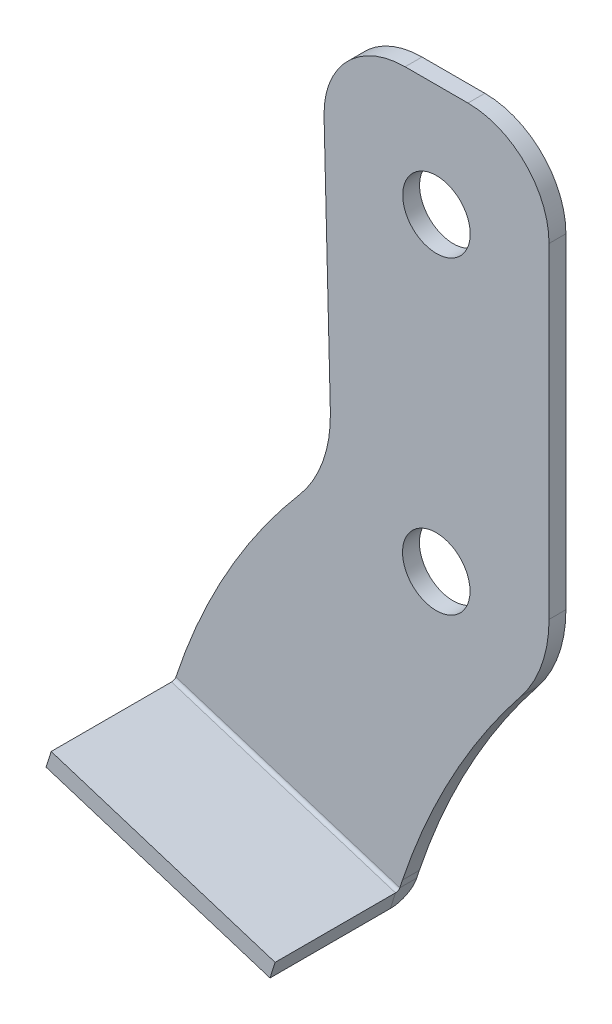
ISO-10303-21;
HEADER;
FILE_DESCRIPTION(('STEP AP214'),'2;1');
FILE_NAME('part.step','',(''),(''),'','','');
FILE_SCHEMA(('AUTOMOTIVE_DESIGN { 1 0 10303 214 1 1 1 1 }'));
ENDSEC;
DATA;
#1=APPLICATION_CONTEXT('core data for automotive mechanical design processes');
#2=APPLICATION_PROTOCOL_DEFINITION('international standard','automotive_design',2000,#1);
#3=PRODUCT_CONTEXT('',#1,'mechanical');
#4=PRODUCT('Part','Part','',(#3));
#5=PRODUCT_RELATED_PRODUCT_CATEGORY('part','',(#4));
#6=PRODUCT_DEFINITION_FORMATION('','',#4);
#7=PRODUCT_DEFINITION_CONTEXT('part definition',#1,'design');
#8=PRODUCT_DEFINITION('design','',#6,#7);
#9=PRODUCT_DEFINITION_SHAPE('','',#8);
#10=(LENGTH_UNIT() NAMED_UNIT(*) SI_UNIT(.MILLI.,.METRE.));
#11=(NAMED_UNIT(*) PLANE_ANGLE_UNIT() SI_UNIT($,.RADIAN.));
#12=(NAMED_UNIT(*) SI_UNIT($,.STERADIAN.) SOLID_ANGLE_UNIT());
#13=UNCERTAINTY_MEASURE_WITH_UNIT(LENGTH_MEASURE(1.E-05),#10,'distance_accuracy_value','');
#14=(GEOMETRIC_REPRESENTATION_CONTEXT(3) GLOBAL_UNCERTAINTY_ASSIGNED_CONTEXT((#13)) GLOBAL_UNIT_ASSIGNED_CONTEXT((#10,
#11,#12)) REPRESENTATION_CONTEXT('',''));
#15=CARTESIAN_POINT('',(0.,0.,0.));
#16=DIRECTION('',(0.,0.,1.));
#17=DIRECTION('',(1.,0.,0.));
#18=AXIS2_PLACEMENT_3D('',#15,#16,#17);
#19=CARTESIAN_POINT('',(6612.86402210719,3373.45886748927,15.));
#20=DIRECTION('',(0.,0.,-1.));
#21=DIRECTION('',(-1.,0.,0.));
#22=AXIS2_PLACEMENT_3D('',#19,#20,#21);
#23=CYLINDRICAL_SURFACE('',#22,634.359253995967);
#24=CARTESIAN_POINT('',(6612.86402210719,3373.45886748927,15.));
#25=DIRECTION('',(0.,0.,-1.));
#26=DIRECTION('',(1.,0.,0.));
#27=AXIS2_PLACEMENT_3D('',#24,#25,#26);
#28=CIRCLE('',#27,634.359253995967);
#29=CARTESIAN_POINT('',(6011.13594484202,3574.29458184577,15.));
#30=VERTEX_POINT('',#29);
#31=CARTESIAN_POINT('',(6116.34409459401,3768.27480525347,15.));
#32=VERTEX_POINT('',#31);
#33=EDGE_CURVE('E146',#30,#32,#28,.T.);
#34=ORIENTED_EDGE('',*,*,#33,.F.);
#35=DIRECTION('',(0.,0.,-1.));
#36=VECTOR('',#35,1.);
#37=CARTESIAN_POINT('',(6011.13594484202,3574.29458184577,15.0000000000001));
#38=LINE('',#37,#36);
#39=CARTESIAN_POINT('',(6011.13594484202,3574.29458184577,0.));
#40=VERTEX_POINT('',#39);
#41=EDGE_CURVE('E159',#30,#40,#38,.T.);
#42=ORIENTED_EDGE('',*,*,#41,.T.);
#43=CARTESIAN_POINT('',(6612.86402210719,3373.45886748927,0.));
#44=DIRECTION('',(0.,0.,-1.));
#45=DIRECTION('',(-1.,0.,0.));
#46=AXIS2_PLACEMENT_3D('',#43,#44,#45);
#47=CIRCLE('',#46,634.359253995967);
#48=CARTESIAN_POINT('',(6116.34409459401,3768.27480525347,0.));
#49=VERTEX_POINT('',#48);
#50=EDGE_CURVE('E161',#40,#49,#47,.T.);
#51=ORIENTED_EDGE('',*,*,#50,.T.);
#52=DIRECTION('',(0.,0.,1.));
#53=VECTOR('',#52,1.);
#54=CARTESIAN_POINT('',(6116.34409459401,3768.27480525347,15.));
#55=LINE('',#54,#53);
#56=EDGE_CURVE('E158',#49,#32,#55,.T.);
#57=ORIENTED_EDGE('',*,*,#56,.T.);
#58=EDGE_LOOP('',(#34,#42,#51,#57));
#59=FACE_BOUND('',#58,.T.);
#60=ADVANCED_FACE('F38',(#59),#23,.F.);
#61=CARTESIAN_POINT('',(6357.69035348699,3450.16649474972,15.));
#62=DIRECTION('',(0.,0.,1.));
#63=DIRECTION('',(1.,0.,0.));
#64=AXIS2_PLACEMENT_3D('',#61,#62,#63);
#65=PLANE('',#64);
#66=DIRECTION('',(-0.300852104091953,-0.953670808750821,0.));
#67=VECTOR('',#66,1.);
#68=CARTESIAN_POINT('',(6011.05306640325,3574.32072729602,15.0000000000026));
#69=LINE('',#68,#67);
#70=CARTESIAN_POINT('',(6011.05306640325,3574.32072729602,15.));
#71=VERTEX_POINT('',#70);
#72=CARTESIAN_POINT('',(6008.79667562256,3567.16819623039,15.));
#73=VERTEX_POINT('',#72);
#74=EDGE_CURVE('E166',#71,#73,#69,.T.);
#75=ORIENTED_EDGE('',*,*,#74,.F.);
#76=DIRECTION('',(-0.953670808750838,0.300852104091899,0.));
#77=VECTOR('',#76,1.);
#78=CARTESIAN_POINT('',(6018.20559746888,3572.06433651533,15.0000000000026));
#79=LINE('',#78,#77);
#80=EDGE_CURVE('E165',#30,#71,#79,.T.);
#81=ORIENTED_EDGE('',*,*,#80,.F.);
#82=ORIENTED_EDGE('',*,*,#33,.T.);
#83=CARTESIAN_POINT('',(6026.0677441371,3840.05952121064,15.));
#84=DIRECTION('',(0.,0.,1.));
#85=DIRECTION('',(1.,0.,0.));
#86=AXIS2_PLACEMENT_3D('',#83,#84,#85);
#87=CIRCLE('',#86,115.338046181084);
#88=CARTESIAN_POINT('',(6141.40579031818,3840.05952121064,15.));
#89=VERTEX_POINT('',#88);
#90=EDGE_CURVE('E128',#32,#89,#87,.T.);
#91=ORIENTED_EDGE('',*,*,#90,.T.);
#92=DIRECTION('',(0.,1.,0.));
#93=VECTOR('',#92,1.);
#94=CARTESIAN_POINT('',(6141.40579031818,4129.48336341519,15.));
#95=LINE('',#94,#93);
#96=CARTESIAN_POINT('',(6141.40579031818,4129.48336341519,15.));
#97=VERTEX_POINT('',#96);
#98=EDGE_CURVE('E143',#89,#97,#95,.T.);
#99=ORIENTED_EDGE('',*,*,#98,.T.);
#100=CARTESIAN_POINT('',(6069.319511455,4129.48336341519,15.));
#101=DIRECTION('',(0.,0.,1.));
#102=DIRECTION('',(1.,0.,0.));
#103=AXIS2_PLACEMENT_3D('',#100,#101,#102);
#104=CIRCLE('',#103,72.0862788631784);
#105=CARTESIAN_POINT('',(6069.319511455,4201.56964227837,15.));
#106=VERTEX_POINT('',#105);
#107=EDGE_CURVE('E151',#97,#106,#104,.T.);
#108=ORIENTED_EDGE('',*,*,#107,.T.);
#109=DIRECTION('',(-1.,0.,0.));
#110=VECTOR('',#109,1.);
#111=CARTESIAN_POINT('',(6013.4696861779,4201.56964227837,15.));
#112=LINE('',#111,#110);
#113=CARTESIAN_POINT('',(6013.4696861779,4201.56964227837,15.));
#114=VERTEX_POINT('',#113);
#115=EDGE_CURVE('E153',#106,#114,#112,.T.);
#116=ORIENTED_EDGE('',*,*,#115,.T.);
#117=CARTESIAN_POINT('',(6013.4696861779,4129.48336341519,15.));
#118=DIRECTION('',(0.,0.,1.));
#119=DIRECTION('',(1.,0.,0.));
#120=AXIS2_PLACEMENT_3D('',#117,#118,#119);
#121=CIRCLE('',#120,72.0862788631777);
#122=CARTESIAN_POINT('',(5941.40579031818,4127.68711347154,15.));
#123=VERTEX_POINT('',#122);
#124=EDGE_CURVE('E182',#114,#123,#121,.T.);
#125=ORIENTED_EDGE('',*,*,#124,.T.);
#126=DIRECTION('',(0.0249180561402385,-0.99968949703305,0.));
#127=VECTOR('',#126,1.);
#128=CARTESIAN_POINT('',(5947.01227174512,3902.76023449351,15.));
#129=LINE('',#128,#127);
#130=CARTESIAN_POINT('',(5947.01227174512,3902.76023449351,15.));
#131=VERTEX_POINT('',#130);
#132=EDGE_CURVE('E178',#123,#131,#129,.T.);
#133=ORIENTED_EDGE('',*,*,#132,.T.);
#134=CARTESIAN_POINT('',(5831.71003836958,3899.88623458366,15.));
#135=DIRECTION('',(0.,0.,-1.));
#136=DIRECTION('',(1.,0.,0.));
#137=AXIS2_PLACEMENT_3D('',#134,#135,#136);
#138=CIRCLE('',#137,115.338046181084);
#139=CARTESIAN_POINT('',(5919.37342422251,3824.93294461137,15.));
#140=VERTEX_POINT('',#139);
#141=EDGE_CURVE('E173',#131,#140,#138,.T.);
#142=ORIENTED_EDGE('',*,*,#141,.T.);
#143=CARTESIAN_POINT('',(6357.69035348699,3450.16649474972,15.));
#144=DIRECTION('',(0.,0.,1.));
#145=DIRECTION('',(1.,0.,0.));
#146=AXIS2_PLACEMENT_3D('',#143,#144,#145);
#147=CIRCLE('',#146,576.690230905426);
#148=CARTESIAN_POINT('',(5809.74425528959,3629.96275692442,15.));
#149=VERTEX_POINT('',#148);
#150=EDGE_CURVE('E171',#140,#149,#147,.T.);
#151=ORIENTED_EDGE('',*,*,#150,.T.);
#152=DIRECTION('',(0.953670808750845,-0.300852104091878,0.));
#153=VECTOR('',#152,1.);
#154=CARTESIAN_POINT('',(6008.79667562256,3567.16819623039,15.0000000000026));
#155=LINE('',#154,#153);
#156=EDGE_CURVE('E269',#73,#149,#155,.F.);
#157=ORIENTED_EDGE('',*,*,#156,.F.);
#158=EDGE_LOOP('',(#75,#81,#82,#91,#99,#108,#116,#125,#133,#142,#151,#157));
#159=FACE_BOUND('',#158,.T.);
#160=CARTESIAN_POINT('',(6041.15278590267,3826.72104320698,15.));
#161=DIRECTION('',(0.,0.,1.));
#162=DIRECTION('',(1.,0.,0.));
#163=AXIS2_PLACEMENT_3D('',#160,#161,#162);
#164=CIRCLE('',#163,29.9999999999998);
#165=CARTESIAN_POINT('',(6071.15278590267,3826.72104320698,15.));
#166=VERTEX_POINT('',#165);
#167=EDGE_CURVE('E320',#166,#166,#164,.T.);
#168=ORIENTED_EDGE('',*,*,#167,.F.);
#169=EDGE_LOOP('',(#168));
#170=FACE_BOUND('',#169,.T.);
#171=CARTESIAN_POINT('',(6041.32431164851,4101.72104320698,15.));
#172=DIRECTION('',(0.,0.,1.));
#173=DIRECTION('',(1.,0.,0.));
#174=AXIS2_PLACEMENT_3D('',#171,#172,#173);
#175=CIRCLE('',#174,30.);
#176=CARTESIAN_POINT('',(6071.32431164851,4101.72104320698,15.));
#177=VERTEX_POINT('',#176);
#178=EDGE_CURVE('E326',#177,#177,#175,.T.);
#179=ORIENTED_EDGE('',*,*,#178,.F.);
#180=EDGE_LOOP('',(#179));
#181=FACE_BOUND('',#180,.T.);
#182=ADVANCED_FACE('F140',(#159,#170,#181),#65,.T.);
#183=CARTESIAN_POINT('',(6357.69035348699,3450.16649474972,0.));
#184=DIRECTION('',(0.,0.,1.));
#185=DIRECTION('',(1.,0.,0.));
#186=AXIS2_PLACEMENT_3D('',#183,#184,#185);
#187=PLANE('',#186);
#188=DIRECTION('',(0.953670808750838,-0.300852104091899,0.));
#189=VECTOR('',#188,1.);
#190=CARTESIAN_POINT('',(6361.93709459733,3463.6282354993,0.));
#191=LINE('',#190,#189);
#192=CARTESIAN_POINT('',(6011.05306640325,3574.32072729602,0.));
#193=VERTEX_POINT('',#192);
#194=EDGE_CURVE('E11',#193,#40,#191,.T.);
#195=ORIENTED_EDGE('',*,*,#194,.F.);
#196=DIRECTION('',(0.300852104091953,0.953670808750821,0.));
#197=VECTOR('',#196,1.);
#198=CARTESIAN_POINT('',(6006.80632529292,3560.85898654647,0.));
#199=LINE('',#198,#197);
#200=CARTESIAN_POINT('',(6008.79667562255,3567.16819623037,2.56045185054177E-12));
#201=VERTEX_POINT('',#200);
#202=EDGE_CURVE('E169',#201,#193,#199,.T.);
#203=ORIENTED_EDGE('',*,*,#202,.F.);
#204=DIRECTION('',(0.953670808750845,-0.300852104091878,0.));
#205=VECTOR('',#204,1.);
#206=CARTESIAN_POINT('',(6008.79667562255,3567.16819623038,2.56045185054177E-12));
#207=LINE('',#206,#205);
#208=CARTESIAN_POINT('',(5809.74425528959,3629.96275692442,0.));
#209=VERTEX_POINT('',#208);
#210=EDGE_CURVE('E239',#201,#209,#207,.F.);
#211=ORIENTED_EDGE('',*,*,#210,.T.);
#212=CARTESIAN_POINT('',(6357.69035348699,3450.16649474972,0.));
#213=DIRECTION('',(0.,0.,1.));
#214=DIRECTION('',(1.,0.,0.));
#215=AXIS2_PLACEMENT_3D('',#212,#213,#214);
#216=CIRCLE('',#215,576.690230905426);
#217=CARTESIAN_POINT('',(5919.37342422251,3824.93294461137,0.));
#218=VERTEX_POINT('',#217);
#219=EDGE_CURVE('E42',#218,#209,#216,.T.);
#220=ORIENTED_EDGE('',*,*,#219,.F.);
#221=CARTESIAN_POINT('',(5831.71003836958,3899.88623458366,0.));
#222=DIRECTION('',(0.,0.,-1.));
#223=DIRECTION('',(-1.,0.,0.));
#224=AXIS2_PLACEMENT_3D('',#221,#222,#223);
#225=CIRCLE('',#224,115.338046181084);
#226=CARTESIAN_POINT('',(5947.01227174512,3902.76023449351,0.));
#227=VERTEX_POINT('',#226);
#228=EDGE_CURVE('E185',#227,#218,#225,.T.);
#229=ORIENTED_EDGE('',*,*,#228,.F.);
#230=DIRECTION('',(0.0249180561402385,-0.99968949703305,0.));
#231=VECTOR('',#230,1.);
#232=CARTESIAN_POINT('',(5947.01227174512,3902.76023449351,0.));
#233=LINE('',#232,#231);
#234=CARTESIAN_POINT('',(5941.40579031818,4127.68711347154,0.));
#235=VERTEX_POINT('',#234);
#236=EDGE_CURVE('E204',#235,#227,#233,.T.);
#237=ORIENTED_EDGE('',*,*,#236,.F.);
#238=CARTESIAN_POINT('',(6013.4696861779,4129.48336341519,0.));
#239=DIRECTION('',(0.,0.,1.));
#240=DIRECTION('',(1.,0.,0.));
#241=AXIS2_PLACEMENT_3D('',#238,#239,#240);
#242=CIRCLE('',#241,72.0862788631777);
#243=CARTESIAN_POINT('',(6013.4696861779,4201.56964227837,0.));
#244=VERTEX_POINT('',#243);
#245=EDGE_CURVE('E200',#244,#235,#242,.T.);
#246=ORIENTED_EDGE('',*,*,#245,.F.);
#247=DIRECTION('',(1.,0.,0.));
#248=VECTOR('',#247,1.);
#249=CARTESIAN_POINT('',(6357.69035348699,4201.56964227837,0.));
#250=LINE('',#249,#248);
#251=CARTESIAN_POINT('',(6069.319511455,4201.56964227837,0.));
#252=VERTEX_POINT('',#251);
#253=EDGE_CURVE('E220',#252,#244,#250,.F.);
#254=ORIENTED_EDGE('',*,*,#253,.F.);
#255=CARTESIAN_POINT('',(6069.319511455,4129.48336341519,0.));
#256=DIRECTION('',(0.,0.,1.));
#257=DIRECTION('',(1.,0.,0.));
#258=AXIS2_PLACEMENT_3D('',#255,#256,#257);
#259=CIRCLE('',#258,72.0862788631784);
#260=CARTESIAN_POINT('',(6141.40579031818,4129.48336341519,0.));
#261=VERTEX_POINT('',#260);
#262=EDGE_CURVE('E216',#261,#252,#259,.T.);
#263=ORIENTED_EDGE('',*,*,#262,.F.);
#264=DIRECTION('',(0.,1.,0.));
#265=VECTOR('',#264,1.);
#266=CARTESIAN_POINT('',(6141.40579031818,3450.16649474972,0.));
#267=LINE('',#266,#265);
#268=CARTESIAN_POINT('',(6141.40579031818,3840.05952121064,0.));
#269=VERTEX_POINT('',#268);
#270=EDGE_CURVE('E135',#269,#261,#267,.T.);
#271=ORIENTED_EDGE('',*,*,#270,.F.);
#272=CARTESIAN_POINT('',(6026.0677441371,3840.05952121064,0.));
#273=DIRECTION('',(0.,0.,1.));
#274=DIRECTION('',(1.,0.,0.));
#275=AXIS2_PLACEMENT_3D('',#272,#273,#274);
#276=CIRCLE('',#275,115.338046181084);
#277=EDGE_CURVE('E130',#49,#269,#276,.T.);
#278=ORIENTED_EDGE('',*,*,#277,.F.);
#279=ORIENTED_EDGE('',*,*,#50,.F.);
#280=EDGE_LOOP('',(#195,#203,#211,#220,#229,#237,#246,#254,#263,#271,#278,#279));
#281=FACE_BOUND('',#280,.T.);
#282=CARTESIAN_POINT('',(6041.15278590267,3826.72104320698,0.));
#283=DIRECTION('',(0.,0.,1.));
#284=DIRECTION('',(1.,0.,0.));
#285=AXIS2_PLACEMENT_3D('',#282,#283,#284);
#286=CIRCLE('',#285,29.9999999999998);
#287=CARTESIAN_POINT('',(6071.15278590267,3826.72104320698,0.));
#288=VERTEX_POINT('',#287);
#289=EDGE_CURVE('E313',#288,#288,#286,.F.);
#290=ORIENTED_EDGE('',*,*,#289,.F.);
#291=EDGE_LOOP('',(#290));
#292=FACE_BOUND('',#291,.T.);
#293=CARTESIAN_POINT('',(6041.32431164851,4101.72104320698,0.));
#294=DIRECTION('',(0.,0.,1.));
#295=DIRECTION('',(1.,0.,0.));
#296=AXIS2_PLACEMENT_3D('',#293,#294,#295);
#297=CIRCLE('',#296,30.);
#298=CARTESIAN_POINT('',(6071.32431164851,4101.72104320698,0.));
#299=VERTEX_POINT('',#298);
#300=EDGE_CURVE('E323',#299,#299,#297,.F.);
#301=ORIENTED_EDGE('',*,*,#300,.F.);
#302=EDGE_LOOP('',(#301));
#303=FACE_BOUND('',#302,.T.);
#304=ADVANCED_FACE('F333',(#281,#292,#303),#187,.F.);
#305=CARTESIAN_POINT('',(6026.0677441371,3840.05952121064,15.));
#306=DIRECTION('',(0.,0.,1.));
#307=DIRECTION('',(1.,0.,0.));
#308=AXIS2_PLACEMENT_3D('',#305,#306,#307);
#309=CYLINDRICAL_SURFACE('',#308,115.338046181084);
#310=ORIENTED_EDGE('',*,*,#56,.F.);
#311=ORIENTED_EDGE('',*,*,#277,.T.);
#312=DIRECTION('',(0.,0.,1.));
#313=VECTOR('',#312,1.);
#314=CARTESIAN_POINT('',(6141.40579031818,3840.05952121064,15.));
#315=LINE('',#314,#313);
#316=EDGE_CURVE('E124',#269,#89,#315,.T.);
#317=ORIENTED_EDGE('',*,*,#316,.T.);
#318=ORIENTED_EDGE('',*,*,#90,.F.);
#319=EDGE_LOOP('',(#310,#311,#317,#318));
#320=FACE_BOUND('',#319,.T.);
#321=ADVANCED_FACE('F127',(#320),#309,.T.);
#322=CARTESIAN_POINT('',(6141.40579031818,4129.48336341519,15.));
#323=DIRECTION('',(1.,0.,0.));
#324=DIRECTION('',(0.,1.,0.));
#325=AXIS2_PLACEMENT_3D('',#322,#323,#324);
#326=PLANE('',#325);
#327=ORIENTED_EDGE('',*,*,#316,.F.);
#328=ORIENTED_EDGE('',*,*,#270,.T.);
#329=DIRECTION('',(0.,0.,1.));
#330=VECTOR('',#329,1.);
#331=CARTESIAN_POINT('',(6141.40579031818,4129.48336341519,15.));
#332=LINE('',#331,#330);
#333=EDGE_CURVE('E150',#261,#97,#332,.T.);
#334=ORIENTED_EDGE('',*,*,#333,.T.);
#335=ORIENTED_EDGE('',*,*,#98,.F.);
#336=EDGE_LOOP('',(#327,#328,#334,#335));
#337=FACE_BOUND('',#336,.T.);
#338=ADVANCED_FACE('F149',(#337),#326,.T.);
#339=CARTESIAN_POINT('',(6069.319511455,4129.48336341519,15.));
#340=DIRECTION('',(0.,0.,1.));
#341=DIRECTION('',(1.,0.,0.));
#342=AXIS2_PLACEMENT_3D('',#339,#340,#341);
#343=CYLINDRICAL_SURFACE('',#342,72.0862788631784);
#344=ORIENTED_EDGE('',*,*,#333,.F.);
#345=ORIENTED_EDGE('',*,*,#262,.T.);
#346=DIRECTION('',(0.,0.,1.));
#347=VECTOR('',#346,1.);
#348=CARTESIAN_POINT('',(6069.319511455,4201.56964227837,15.));
#349=LINE('',#348,#347);
#350=EDGE_CURVE('E219',#252,#106,#349,.T.);
#351=ORIENTED_EDGE('',*,*,#350,.T.);
#352=ORIENTED_EDGE('',*,*,#107,.F.);
#353=EDGE_LOOP('',(#344,#345,#351,#352));
#354=FACE_BOUND('',#353,.T.);
#355=ADVANCED_FACE('F363',(#354),#343,.T.);
#356=CARTESIAN_POINT('',(6013.4696861779,4201.56964227837,15.));
#357=DIRECTION('',(0.,1.,0.));
#358=DIRECTION('',(-1.,0.,0.));
#359=AXIS2_PLACEMENT_3D('',#356,#357,#358);
#360=PLANE('',#359);
#361=ORIENTED_EDGE('',*,*,#350,.F.);
#362=ORIENTED_EDGE('',*,*,#253,.T.);
#363=DIRECTION('',(0.,0.,1.));
#364=VECTOR('',#363,1.);
#365=CARTESIAN_POINT('',(6013.4696861779,4201.56964227837,15.));
#366=LINE('',#365,#364);
#367=EDGE_CURVE('E197',#244,#114,#366,.T.);
#368=ORIENTED_EDGE('',*,*,#367,.T.);
#369=ORIENTED_EDGE('',*,*,#115,.F.);
#370=EDGE_LOOP('',(#361,#362,#368,#369));
#371=FACE_BOUND('',#370,.T.);
#372=ADVANCED_FACE('F360',(#371),#360,.T.);
#373=CARTESIAN_POINT('',(6013.4696861779,4129.48336341519,15.));
#374=DIRECTION('',(0.,0.,1.));
#375=DIRECTION('',(1.,0.,0.));
#376=AXIS2_PLACEMENT_3D('',#373,#374,#375);
#377=CYLINDRICAL_SURFACE('',#376,72.0862788631777);
#378=ORIENTED_EDGE('',*,*,#367,.F.);
#379=ORIENTED_EDGE('',*,*,#245,.T.);
#380=DIRECTION('',(0.,0.,1.));
#381=VECTOR('',#380,1.);
#382=CARTESIAN_POINT('',(5941.40579031818,4127.68711347154,15.));
#383=LINE('',#382,#381);
#384=EDGE_CURVE('E199',#235,#123,#383,.T.);
#385=ORIENTED_EDGE('',*,*,#384,.T.);
#386=ORIENTED_EDGE('',*,*,#124,.F.);
#387=EDGE_LOOP('',(#378,#379,#385,#386));
#388=FACE_BOUND('',#387,.T.);
#389=ADVANCED_FACE('F195',(#388),#377,.T.);
#390=CARTESIAN_POINT('',(5947.01227174512,3902.76023449351,15.));
#391=DIRECTION('',(-0.99968949703305,-0.0249180561402385,0.));
#392=DIRECTION('',(0.0249180561402385,-0.99968949703305,0.));
#393=AXIS2_PLACEMENT_3D('',#390,#391,#392);
#394=PLANE('',#393);
#395=ORIENTED_EDGE('',*,*,#384,.F.);
#396=ORIENTED_EDGE('',*,*,#236,.T.);
#397=DIRECTION('',(0.,0.,1.));
#398=VECTOR('',#397,1.);
#399=CARTESIAN_POINT('',(5947.01227174512,3902.76023449351,15.));
#400=LINE('',#399,#398);
#401=EDGE_CURVE('E206',#227,#131,#400,.T.);
#402=ORIENTED_EDGE('',*,*,#401,.T.);
#403=ORIENTED_EDGE('',*,*,#132,.F.);
#404=EDGE_LOOP('',(#395,#396,#402,#403));
#405=FACE_BOUND('',#404,.T.);
#406=ADVANCED_FACE('F354',(#405),#394,.T.);
#407=CARTESIAN_POINT('',(5831.71003836958,3899.88623458366,15.));
#408=DIRECTION('',(0.,0.,-1.));
#409=DIRECTION('',(-1.,0.,0.));
#410=AXIS2_PLACEMENT_3D('',#407,#408,#409);
#411=CYLINDRICAL_SURFACE('',#410,115.338046181084);
#412=ORIENTED_EDGE('',*,*,#401,.F.);
#413=ORIENTED_EDGE('',*,*,#228,.T.);
#414=DIRECTION('',(0.,0.,1.));
#415=VECTOR('',#414,1.);
#416=CARTESIAN_POINT('',(5919.37342422251,3824.93294461137,15.));
#417=LINE('',#416,#415);
#418=EDGE_CURVE('E212',#218,#140,#417,.T.);
#419=ORIENTED_EDGE('',*,*,#418,.T.);
#420=ORIENTED_EDGE('',*,*,#141,.F.);
#421=EDGE_LOOP('',(#412,#413,#419,#420));
#422=FACE_BOUND('',#421,.T.);
#423=ADVANCED_FACE('F351',(#422),#411,.F.);
#424=CARTESIAN_POINT('',(6357.69035348699,3450.16649474972,15.));
#425=DIRECTION('',(0.,0.,1.));
#426=DIRECTION('',(1.,0.,0.));
#427=AXIS2_PLACEMENT_3D('',#424,#425,#426);
#428=CYLINDRICAL_SURFACE('',#427,576.690230905426);
#429=DIRECTION('',(-3.66571207827473E-13,-1.1619937353898E-12,-1.));
#430=VECTOR('',#429,1.);
#431=CARTESIAN_POINT('',(5809.74425528944,3629.96275692397,15.0000000000026));
#432=LINE('',#431,#430);
#433=EDGE_CURVE('E162',#149,#209,#432,.T.);
#434=ORIENTED_EDGE('',*,*,#433,.F.);
#435=ORIENTED_EDGE('',*,*,#150,.F.);
#436=ORIENTED_EDGE('',*,*,#418,.F.);
#437=ORIENTED_EDGE('',*,*,#219,.T.);
#438=EDGE_LOOP('',(#434,#435,#436,#437));
#439=FACE_BOUND('',#438,.T.);
#440=ADVANCED_FACE('F40',(#439),#428,.T.);
#441=CARTESIAN_POINT('',(6011.05306640325,3574.32072729602,15.0000000000026));
#442=DIRECTION('',(0.953670808750821,-0.300852104091953,0.));
#443=DIRECTION('',(0.300852104091953,0.953670808750821,0.));
#444=AXIS2_PLACEMENT_3D('',#441,#442,#443);
#445=PLANE('',#444);
#446=DIRECTION('',(-3.66571207827473E-13,-1.1619937353898E-12,-1.));
#447=VECTOR('',#446,1.);
#448=CARTESIAN_POINT('',(6008.79667562256,3567.16819623039,15.0000000000026));
#449=LINE('',#448,#447);
#450=EDGE_CURVE('E231',#73,#201,#449,.T.);
#451=ORIENTED_EDGE('',*,*,#450,.T.);
#452=ORIENTED_EDGE('',*,*,#202,.T.);
#453=DIRECTION('',(0.,0.,-1.));
#454=VECTOR('',#453,1.);
#455=CARTESIAN_POINT('',(6011.05306640325,3574.32072729602,15.0000000000026));
#456=LINE('',#455,#454);
#457=EDGE_CURVE('E48',#71,#193,#456,.T.);
#458=ORIENTED_EDGE('',*,*,#457,.F.);
#459=ORIENTED_EDGE('',*,*,#74,.T.);
#460=EDGE_LOOP('',(#451,#452,#458,#459));
#461=FACE_BOUND('',#460,.T.);
#462=ADVANCED_FACE('F343',(#461),#445,.T.);
#463=CARTESIAN_POINT('',(6018.20559746888,3572.06433651533,15.0000000000026));
#464=DIRECTION('',(-0.300852104091899,-0.953670808750838,0.));
#465=DIRECTION('',(0.953670808750838,-0.300852104091899,0.));
#466=AXIS2_PLACEMENT_3D('',#463,#464,#465);
#467=PLANE('',#466);
#468=ORIENTED_EDGE('',*,*,#41,.F.);
#469=ORIENTED_EDGE('',*,*,#80,.T.);
#470=ORIENTED_EDGE('',*,*,#457,.T.);
#471=ORIENTED_EDGE('',*,*,#194,.T.);
#472=EDGE_LOOP('',(#468,#469,#470,#471));
#473=FACE_BOUND('',#472,.T.);
#474=ADVANCED_FACE('F346',(#473),#467,.T.);
#475=CARTESIAN_POINT('',(5809.74425528945,3629.96275692399,-0.149999999997436));
#476=CARTESIAN_POINT('',(5809.02723770046,3627.69725657591,-0.14999999999997));
#477=CARTESIAN_POINT('',(5808.31075985005,3625.43346448646,0.322395918468333));
#478=CARTESIAN_POINT('',(5806.98580093143,3621.24822186658,2.14077705136605));
#479=CARTESIAN_POINT('',(5806.37796876652,3619.32882696504,3.48604681046894));
#480=CARTESIAN_POINT('',(5805.36289659202,3616.12589405103,6.84597703245116));
#481=CARTESIAN_POINT('',(5804.95605430561,3614.84361678094,8.85931550626345));
#482=CARTESIAN_POINT('',(5804.40476041812,3613.11081423344,13.2492758988762));
#483=CARTESIAN_POINT('',(5804.26052444461,3612.66097114459,15.6237422004991));
#484=CARTESIAN_POINT('',(5804.25840901446,3612.66163849396,17.9999999999997));
#485=CARTESIAN_POINT('',(5809.74425528945,3629.96275692399,2.56392129749372E-12));
#486=CARTESIAN_POINT('',(5809.03314598277,3627.71598523459,0.));
#487=CARTESIAN_POINT('',(5808.32257196031,3625.47090768394,0.468491819968615));
#488=CARTESIAN_POINT('',(5807.00852815592,3621.32026487463,2.27184500961924));
#489=CARTESIAN_POINT('',(5806.40570191759,3619.41673825515,3.60599683682872));
#490=CARTESIAN_POINT('',(5805.39898380984,3616.24028688967,6.93815904044744));
#491=CARTESIAN_POINT('',(5804.99548637663,3614.96861246669,8.93485835331914));
#492=CARTESIAN_POINT('',(5804.44871367749,3613.25014162998,13.2885380815301));
#493=CARTESIAN_POINT('',(5804.30565226023,3612.80402176591,15.6433806947316));
#494=CARTESIAN_POINT('',(5804.30353683008,3612.80468911527,17.9999999999997));
#495=CARTESIAN_POINT('',(5809.74425528944,3629.96275692398,15.0000000000026));
#496=CARTESIAN_POINT('',(5809.62397421388,3629.58885110231,15.0000000000021));
#497=CARTESIAN_POINT('',(5809.50378298657,3629.21522743242,15.0780819699968));
#498=CARTESIAN_POINT('',(5809.28125060449,3628.52456567931,15.3786408349383));
#499=CARTESIAN_POINT('',(5809.1790170241,3628.20786726695,15.6009994728063));
#500=CARTESIAN_POINT('',(5809.00770559146,3627.67957075449,16.1563598400757));
#501=CARTESIAN_POINT('',(5808.93869347858,3627.46818104155,16.4891430588875));
#502=CARTESIAN_POINT('',(5808.84403961404,3627.18288128387,17.2147563469221));
#503=CARTESIAN_POINT('',(5808.81843382159,3627.10908389717,17.6072301179842));
#504=CARTESIAN_POINT('',(5808.81631839146,3627.10975124654,17.9999999999998));
#505=CARTESIAN_POINT('',(5809.74425528944,3629.96275692398,15.1515000000026));
#506=CARTESIAN_POINT('',(5809.62994157902,3629.60776704757,15.1515000000022));
#507=CARTESIAN_POINT('',(5809.51571321794,3629.25304506188,15.2256388305121));
#508=CARTESIAN_POINT('',(5809.30420510122,3628.59732911744,15.5110194727741));
#509=CARTESIAN_POINT('',(5809.20702750667,3628.29665766997,15.7221489994297));
#510=CARTESIAN_POINT('',(5809.04415368145,3627.79510752152,16.2494636681519));
#511=CARTESIAN_POINT('',(5808.97851987031,3627.59442668415,16.5654413344138));
#512=CARTESIAN_POINT('',(5808.888432406,3627.32360195438,17.2544111514026));
#513=CARTESIAN_POINT('',(5808.86401291536,3627.2535650247,17.6270649971591));
#514=CARTESIAN_POINT('',(5808.86189748523,3627.25423237406,17.9999999999998));
#515=B_SPLINE_SURFACE_WITH_KNOTS('',1,3,((#475,#476,#477,#478,#479,#480,#481,#482,#483,#484),
(#485,#486,#487,#488,#489,#490,#491,#492,#493,#494),(#495,#496,#497,#498,#499,#500,#501,#502,
#503,#504),(#505,#506,#507,#508,#509,#510,#511,#512,#513,#514)),.UNSPECIFIED.,.F.,.F.,.F.,(2,1,
1,2),(4,2,2,2,4),(-0.01,0.,1.,1.0101),(0.,0.25,0.5,0.75,1.),.UNSPECIFIED.);
#516=DIRECTION('',(-0.300852104091907,-0.953670808750835,0.));
#517=VECTOR('',#516,1.);
#518=CARTESIAN_POINT('',(5808.81631839146,3627.10975124654,17.9999999999998));
#519=LINE('',#518,#517);
#520=CARTESIAN_POINT('',(5808.81631839146,3627.10975124654,17.9999999999998));
#521=VERTEX_POINT('',#520);
#522=CARTESIAN_POINT('',(5804.30353683008,3612.80468911527,17.9999999999997));
#523=VERTEX_POINT('',#522);
#524=EDGE_CURVE('E309',#521,#523,#519,.T.);
#525=CARTESIAN_POINT('',(5809.74425528944,3629.96275692398,15.0000000000026));
#526=CARTESIAN_POINT('',(5809.72922285031,3629.91602707398,14.9999989587362));
#527=CARTESIAN_POINT('',(5809.71419043782,3629.86929730848,15.001204748627));
#528=CARTESIAN_POINT('',(5809.68416117608,3629.77595050932,15.0060225141468));
#529=CARTESIAN_POINT('',(5809.66916432682,3629.72933347565,15.0096344897757));
#530=CARTESIAN_POINT('',(5809.63924170143,3629.63632470297,15.0192571501956));
#531=CARTESIAN_POINT('',(5809.6243159253,3629.58993296397,15.0252678349865));
#532=CARTESIAN_POINT('',(5809.59457076192,3629.49748672794,15.0396731052291));
#533=CARTESIAN_POINT('',(5809.57975137466,3629.45143223091,15.0480676906808));
#534=CARTESIAN_POINT('',(5809.5502540546,3629.35977163319,15.0672206269037));
#535=CARTESIAN_POINT('',(5809.5355761218,3629.3141655325,15.077978977675));
#536=CARTESIAN_POINT('',(5809.5063964338,3629.22351179638,15.1018335031614));
#537=CARTESIAN_POINT('',(5809.49189467861,3629.17846416095,15.1149296778766));
#538=CARTESIAN_POINT('',(5809.46310164501,3629.08903608026,15.1434283077335));
#539=CARTESIAN_POINT('',(5809.44881036661,3629.044655635,15.1588307628753));
#540=CARTESIAN_POINT('',(5809.42047207859,3628.95666905189,15.1919048460298));
#541=CARTESIAN_POINT('',(5809.40642506897,3628.91306291404,15.2095764740425));
#542=CARTESIAN_POINT('',(5809.37860852209,3628.82673019769,15.2471463308926));
#543=CARTESIAN_POINT('',(5809.36483898483,3628.78400361919,15.26704455973));
#544=CARTESIAN_POINT('',(5809.33760991776,3628.69953315455,15.3090196815319));
#545=CARTESIAN_POINT('',(5809.32415038795,3628.6577892684,15.3310965744964));
#546=CARTESIAN_POINT('',(5809.29757312406,3628.57538495406,15.377375839416));
#547=CARTESIAN_POINT('',(5809.28445538997,3628.53472452586,15.401578211371));
#548=CARTESIAN_POINT('',(5809.25859268238,3628.45458528289,15.4520501286294));
#549=CARTESIAN_POINT('',(5809.24584770887,3628.41510646811,15.4783196739327));
#550=CARTESIAN_POINT('',(5809.22076058928,3628.33742576081,15.532862652254));
#551=CARTESIAN_POINT('',(5809.20841844319,3628.29922386829,15.5611360852721));
#552=CARTESIAN_POINT('',(5809.18416607483,3628.22418923815,15.6196187258459));
#553=CARTESIAN_POINT('',(5809.17225585255,3628.18735650053,15.6498279334015));
#554=CARTESIAN_POINT('',(5809.14889538766,3628.11514911439,15.7121093464236));
#555=CARTESIAN_POINT('',(5809.13744514505,3628.07977446588,15.7441815518901));
#556=CARTESIAN_POINT('',(5809.11503158721,3628.01056867953,15.8101116959816));
#557=CARTESIAN_POINT('',(5809.10406827198,3627.97673754168,15.8439696346066));
#558=CARTESIAN_POINT('',(5809.08265434357,3627.91070047976,15.9133896782754));
#559=CARTESIAN_POINT('',(5809.0722037304,3627.87849455568,15.9489517833192));
#560=CARTESIAN_POINT('',(5809.05183974562,3627.81578570911,16.0216944875997));
#561=CARTESIAN_POINT('',(5809.04192637402,3627.78528278662,16.0588750868365));
#562=CARTESIAN_POINT('',(5809.02266011767,3627.72605362836,16.1347652081826));
#563=CARTESIAN_POINT('',(5809.01330723291,3627.69732739259,16.173474730292));
#564=CARTESIAN_POINT('',(5808.99518384524,3627.64172101272,16.2523294427542));
#565=CARTESIAN_POINT('',(5808.98641334232,3627.61484086863,16.292474633107));
#566=CARTESIAN_POINT('',(5808.96947521033,3627.56299162965,16.3741039687761));
#567=CARTESIAN_POINT('',(5808.96130758125,3627.53802253476,16.4155881140924));
#568=CARTESIAN_POINT('',(5808.94559423654,3627.49005574788,16.4997954207488));
#569=CARTESIAN_POINT('',(5808.93804852091,3627.46705805588,16.5425185820889));
#570=CARTESIAN_POINT('',(5808.92359654449,3627.42308967914,16.6291009969555));
#571=CARTESIAN_POINT('',(5808.91669028368,3627.4021189944,16.6729602504821));
#572=CARTESIAN_POINT('',(5808.90353321777,3627.36225535332,16.7617091889366));
#573=CARTESIAN_POINT('',(5808.89728241265,3627.34336239696,16.8065988738646));
#574=CARTESIAN_POINT('',(5808.88545067997,3627.30769992846,16.8973005319451));
#575=CARTESIAN_POINT('',(5808.87986975239,3627.29093041631,16.9431125050977));
#576=CARTESIAN_POINT('',(5808.86939058268,3627.25955543595,17.0355483745491));
#577=CARTESIAN_POINT('',(5808.86449234055,3627.24494996773,17.082172270848));
#578=CARTESIAN_POINT('',(5808.85538970559,3627.21793846362,17.1761196656253));
#579=CARTESIAN_POINT('',(5808.85118531277,3627.20553242772,17.2234431641036));
#580=CARTESIAN_POINT('',(5808.84347986638,3627.18294987037,17.3186757564768));
#581=CARTESIAN_POINT('',(5808.83997881281,3627.17277334892,17.3665848503715));
#582=CARTESIAN_POINT('',(5808.83368784945,3627.15467456001,17.4628732175316));
#583=CARTESIAN_POINT('',(5808.83089793965,3627.14675229255,17.511252490797));
#584=CARTESIAN_POINT('',(5808.82603532159,3627.13318121409,17.6083646624707));
#585=CARTESIAN_POINT('',(5808.82396261332,3627.1275324031,17.6570975608791));
#586=CARTESIAN_POINT('',(5808.82053885348,3627.11852236002,17.7547995971433));
#587=CARTESIAN_POINT('',(5808.81918780191,3627.11516112794,17.8037687349991));
#588=CARTESIAN_POINT('',(5808.81720960482,3627.11073337286,17.901825219036));
#589=CARTESIAN_POINT('',(5808.81658245929,3627.10966684988,17.9509125652171));
#590=CARTESIAN_POINT('',(5808.81631839146,3627.10975124654,17.9999999999998));
#591=B_SPLINE_CURVE_WITH_KNOTS('',3,(#525,#526,#527,#528,#529,#530,#531,#532,#533,#534,#535,
#536,#537,#538,#539,#540,#541,#542,#543,#544,#545,#546,#547,#548,#549,#550,#551,#552,#553,#554,
#555,#556,#557,#558,#559,#560,#561,#562,#563,#564,#565,#566,#567,#568,#569,#570,#571,#572,#573,
#574,#575,#576,#577,#578,#579,#580,#581,#582,#583,#584,#585,#586,#587,#588,#589,#590),
.UNSPECIFIED.,.F.,.F.,(4,2,2,2,2,2,2,2,2,2,2,2,2,2,2,2,2,2,2,2,2,2,2,2,2,2,2,2,2,2,2,2,4),(0.,
0.147249719825406,0.294499439650878,0.441749159476273,0.588998879302028,0.73624859912714,
0.883498318952873,1.03074803877821,1.17799775860369,1.32524747842934,1.47249719825466,
1.61974691808045,1.76699663790572,1.91424635773097,2.06149607755671,2.20874579738208,
2.35599551720758,2.50324523703322,2.6504949568585,2.79774467668409,2.94499439650946,
3.09224411633503,3.23949383616045,3.38674355598591,3.53399327581138,3.68124299563694,
3.82849271546244,3.97574243528786,4.1229921551133,4.27024187493877,4.41749159476427,
4.56474131458974,4.71199103441521),.UNSPECIFIED.);
#592=EDGE_CURVE('E264',#149,#521,#591,.T.);
#593=CARTESIAN_POINT('',(5809.74425528945,3629.96275692399,2.56045185054177E-12));
#594=CARTESIAN_POINT('',(5809.65538256011,3629.68196080585,-6.24759568703289E-06));
#595=CARTESIAN_POINT('',(5809.56650999072,3629.40116519469,0.00722849174920632));
#596=CARTESIAN_POINT('',(5809.38897823126,3628.84025036335,0.0361350848678856));
#597=CARTESIAN_POINT('',(5809.3003190412,3628.56013114317,0.0578069386416854));
#598=CARTESIAN_POINT('',(5809.12342709989,3628.00124447079,0.115542901160776));
#599=CARTESIAN_POINT('',(5809.03519434865,3627.7224770186,0.151607009906062));
#600=CARTESIAN_POINT('',(5808.85936717936,3627.16696556607,0.238038631361769));
#601=CARTESIAN_POINT('',(5808.77177276132,3626.89022156573,0.288406144072187));
#602=CARTESIAN_POINT('',(5808.59743265196,3626.3394239431,0.403323761410004));
#603=CARTESIAN_POINT('',(5808.51068696064,3626.0653703208,0.467873866037411));
#604=CARTESIAN_POINT('',(5808.33825264367,3625.52061386774,0.611001018956059));
#605=CARTESIAN_POINT('',(5808.25256401803,3625.24991103698,0.689578067247295));
#606=CARTESIAN_POINT('',(5808.08244962747,3624.7125085165,0.860569846388985));
#607=CARTESIAN_POINT('',(5807.99802386255,3624.44580882679,0.952984577239438));
#608=CARTESIAN_POINT('',(5807.83063794544,3623.91705529179,1.15142907616649));
#609=CARTESIAN_POINT('',(5807.74767779325,3623.6550014465,1.2574588442431));
#610=CARTESIAN_POINT('',(5807.58342232298,3623.13617111207,1.48287798534425));
#611=CARTESIAN_POINT('',(5807.5021270049,3622.87939462292,1.60226735836881));
#612=CARTESIAN_POINT('',(5807.34139641348,3622.37173779872,1.85411808918004));
#613=CARTESIAN_POINT('',(5807.26196114013,3622.12085746366,1.98657944696672));
#614=CARTESIAN_POINT('',(5807.10514136779,3621.62559754127,2.26425503648444));
#615=CARTESIAN_POINT('',(5807.02775686879,3621.38121795394,2.40946926821548));
#616=CARTESIAN_POINT('',(5806.87522443427,3620.89954845975,2.71230077176605));
#617=CARTESIAN_POINT('',(5806.80007649874,3620.6622585529,2.86991804358556));
#618=CARTESIAN_POINT('',(5806.65219759218,3620.19534027278,3.19717591351366));
#619=CARTESIAN_POINT('',(5806.57946662116,3619.9657118995,3.36681651162223));
#620=CARTESIAN_POINT('',(5806.43659622199,3619.51467008232,3.717712355065));
#621=CARTESIAN_POINT('',(5806.36645679384,3619.29325663842,3.8989676003992));
#622=CARTESIAN_POINT('',(5806.22893781551,3618.85917828528,4.27265607853229));
#623=CARTESIAN_POINT('',(5806.16155826534,3618.64651337605,4.46508931133118));
#624=CARTESIAN_POINT('',(5806.0297207293,3618.23044462158,4.86067017588025));
#625=CARTESIAN_POINT('',(5805.96526274343,3618.02704077635,5.06381780763044));
#626=CARTESIAN_POINT('',(5805.839422984,3617.62998436848,5.48033806964372));
#627=CARTESIAN_POINT('',(5805.77804121045,3617.43633180585,5.69371069990681));
#628=CARTESIAN_POINT('',(5805.6585011128,3617.05924469009,6.13016692559037));
#629=CARTESIAN_POINT('',(5805.60034278872,3616.87581013697,6.35325052101084));
#630=CARTESIAN_POINT('',(5805.4873890616,3616.51960115108,6.80859124908795));
#631=CARTESIAN_POINT('',(5805.43259365856,3616.3468267183,7.04084838174459));
#632=CARTESIAN_POINT('',(5805.32649714354,3616.01235440277,7.51397665651808));
#633=CARTESIAN_POINT('',(5805.27519603156,3615.85065652,7.75484779863494));
#634=CARTESIAN_POINT('',(5805.17621105061,3615.53872704978,8.24462381264995));
#635=CARTESIAN_POINT('',(5805.12852718164,3615.38849546233,8.4935286845481));
#636=CARTESIAN_POINT('',(5805.03689092441,3615.09986070469,8.99877252448698));
#637=CARTESIAN_POINT('',(5804.99293853614,3614.9614575345,9.25511149252771));
#638=CARTESIAN_POINT('',(5804.90887048858,3614.69681323775,9.77460598172781));
#639=CARTESIAN_POINT('',(5804.86875482928,3614.57057211117,10.0377615028872));
#640=CARTESIAN_POINT('',(5804.79245624479,3614.3305562283,10.5702551336147));
#641=CARTESIAN_POINT('',(5804.75627331961,3614.216781472,10.8395932431828));
#642=CARTESIAN_POINT('',(5804.68792673451,3614.00197262467,11.3838031916666));
#643=CARTESIAN_POINT('',(5804.65576307458,3613.90093853363,11.6586750305822));
#644=CARTESIAN_POINT('',(5804.59553186733,3613.71185461511,12.2132902472913));
#645=CARTESIAN_POINT('',(5804.56746432001,3613.62380478763,12.4930336250848));
#646=CARTESIAN_POINT('',(5804.51549232127,3613.4609017266,13.0567179937487));
#647=CARTESIAN_POINT('',(5804.49158786985,3613.38604849304,13.3406589846192));
#648=CARTESIAN_POINT('',(5804.44799900254,3613.24971911262,13.9120545388583));
#649=CARTESIAN_POINT('',(5804.42831458664,3613.18824296577,14.199509102227));
#650=CARTESIAN_POINT('',(5804.39321261747,3613.07881619597,14.7772393051881));
#651=CARTESIAN_POINT('',(5804.37779506419,3613.03086557302,15.0675149447804));
#652=CARTESIAN_POINT('',(5804.35126316681,3612.94860506595,15.6501879748233));
#653=CARTESIAN_POINT('',(5804.34014882271,3612.91429518183,15.9425853652738));
#654=CARTESIAN_POINT('',(5804.32225007471,3612.85940088703,16.5287975828595));
#655=CARTESIAN_POINT('',(5804.3154656708,3612.83881647635,16.8226124099947));
#656=CARTESIAN_POINT('',(5804.30624029923,3612.81141590958,17.4109513142167));
#657=CARTESIAN_POINT('',(5804.30379933158,3612.80459975349,17.7054753913035));
#658=CARTESIAN_POINT('',(5804.30353683008,3612.80468911527,17.9999999999997));
#659=B_SPLINE_CURVE_WITH_KNOTS('',3,(#593,#594,#595,#596,#597,#598,#599,#600,#601,#602,#603,
#604,#605,#606,#607,#608,#609,#610,#611,#612,#613,#614,#615,#616,#617,#618,#619,#620,#621,#622,
#623,#624,#625,#626,#627,#628,#629,#630,#631,#632,#633,#634,#635,#636,#637,#638,#639,#640,#641,
#642,#643,#644,#645,#646,#647,#648,#649,#650,#651,#652,#653,#654,#655,#656,#657,#658),
.UNSPECIFIED.,.F.,.F.,(4,2,2,2,2,2,2,2,2,2,2,2,2,2,2,2,2,2,2,2,2,2,2,2,2,2,2,2,2,2,2,2,4),(0.,
0.883484618275821,1.76696923655249,2.65045385482879,3.53393847310492,4.41742309138159,
5.30090770965794,6.18439232793415,7.06787694621035,7.95136156448668,8.8348461827633,
9.71833080103958,10.6018154193158,11.4853000375921,12.3687846558688,13.252269274145,
14.1357538924214,15.0192385106978,15.902723128974,16.7862077472503,17.6696923655266,
18.5531769838029,19.4366616020794,20.3201462203557,21.203630838632,22.0871154569083,
22.9706000751847,23.854084693461,24.7375693117375,25.6210539300137,26.5045385482901,
27.3880231665664,28.2715077848428),.UNSPECIFIED.);
#660=EDGE_CURVE('E234',#209,#523,#659,.T.);
#661=ORIENTED_EDGE('',*,*,#524,.F.);
#662=ORIENTED_EDGE('',*,*,#592,.F.);
#663=ORIENTED_EDGE('',*,*,#433,.T.);
#664=ORIENTED_EDGE('',*,*,#660,.T.);
#665=EDGE_LOOP('',(#661,#662,#663,#664));
#666=FACE_BOUND('',#665,.T.);
#667=ADVANCED_FACE('F260',(#666),#515,.F.);
#668=CARTESIAN_POINT('',(6008.79667562256,3567.1681962304,17.9999999999998));
#669=DIRECTION('',(-0.953670808750845,0.300852104091878,0.));
#670=DIRECTION('',(-0.300852104091878,-0.953670808750845,0.));
#671=AXIS2_PLACEMENT_3D('',#668,#669,#670);
#672=PLANE('',#671);
#673=CARTESIAN_POINT('',(6008.79667562256,3567.1681962304,17.9999999999998));
#674=DIRECTION('',(0.953670808750845,-0.300852104091878,0.));
#675=DIRECTION('',(0.300852104091878,0.953670808750845,0.));
#676=AXIS2_PLACEMENT_3D('',#673,#674,#675);
#677=CIRCLE('',#676,2.99999999999725);
#678=CARTESIAN_POINT('',(6007.89411931029,3564.30718380415,17.9999999999998));
#679=VERTEX_POINT('',#678);
#680=EDGE_CURVE('E276',#679,#73,#677,.T.);
#681=ORIENTED_EDGE('',*,*,#680,.F.);
#682=DIRECTION('',(-0.300852104091907,-0.953670808750835,0.));
#683=VECTOR('',#682,1.);
#684=CARTESIAN_POINT('',(6007.89411931028,3564.30718380414,17.9999999999998));
#685=LINE('',#684,#683);
#686=CARTESIAN_POINT('',(6003.38133774891,3550.00212167288,17.9999999999997));
#687=VERTEX_POINT('',#686);
#688=EDGE_CURVE('E308',#679,#687,#685,.T.);
#689=ORIENTED_EDGE('',*,*,#688,.T.);
#690=CARTESIAN_POINT('',(6008.79667562256,3567.1681962304,17.9999999999998));
#691=DIRECTION('',(0.953670808750845,-0.300852104091878,0.));
#692=DIRECTION('',(0.300852104091878,0.953670808750845,0.));
#693=AXIS2_PLACEMENT_3D('',#690,#691,#692);
#694=CIRCLE('',#693,17.9999999999973);
#695=EDGE_CURVE('E268',#687,#201,#694,.T.);
#696=ORIENTED_EDGE('',*,*,#695,.T.);
#697=ORIENTED_EDGE('',*,*,#450,.F.);
#698=EDGE_LOOP('',(#681,#689,#696,#697));
#699=FACE_BOUND('',#698,.T.);
#700=ADVANCED_FACE('F252',(#699),#672,.F.);
#701=CARTESIAN_POINT('',(6008.79667562256,3567.1681962304,17.9999999999998));
#702=DIRECTION('',(0.953670808750845,-0.300852104091878,0.));
#703=DIRECTION('',(-0.300852104091878,-0.953670808750845,0.));
#704=AXIS2_PLACEMENT_3D('',#701,#702,#703);
#705=CYLINDRICAL_SURFACE('',#704,17.9999999999973);
#706=ORIENTED_EDGE('',*,*,#210,.F.);
#707=ORIENTED_EDGE('',*,*,#695,.F.);
#708=DIRECTION('',(-0.953670808750835,0.300852104091907,0.));
#709=VECTOR('',#708,1.);
#710=CARTESIAN_POINT('',(1561.92282801431,4951.13773957106,17.9999999999997));
#711=LINE('',#710,#709);
#712=EDGE_CURVE('E298',#687,#523,#711,.T.);
#713=ORIENTED_EDGE('',*,*,#712,.T.);
#714=ORIENTED_EDGE('',*,*,#660,.F.);
#715=EDGE_LOOP('',(#706,#707,#713,#714));
#716=FACE_BOUND('',#715,.T.);
#717=ADVANCED_FACE('F241',(#716),#705,.T.);
#718=CARTESIAN_POINT('',(6008.79667562256,3567.1681962304,17.9999999999998));
#719=DIRECTION('',(0.953670808750845,-0.300852104091878,0.));
#720=DIRECTION('',(-0.300852104091878,-0.953670808750845,0.));
#721=AXIS2_PLACEMENT_3D('',#718,#719,#720);
#722=CYLINDRICAL_SURFACE('',#721,2.99999999999725);
#723=ORIENTED_EDGE('',*,*,#156,.T.);
#724=ORIENTED_EDGE('',*,*,#592,.T.);
#725=DIRECTION('',(0.953670808750836,-0.300852104091904,0.));
#726=VECTOR('',#725,1.);
#727=CARTESIAN_POINT('',(5808.81631839146,3627.10975124654,17.9999999999998));
#728=LINE('',#727,#726);
#729=EDGE_CURVE('E312',#521,#679,#728,.T.);
#730=ORIENTED_EDGE('',*,*,#729,.T.);
#731=ORIENTED_EDGE('',*,*,#680,.T.);
#732=EDGE_LOOP('',(#723,#724,#730,#731));
#733=FACE_BOUND('',#732,.T.);
#734=ADVANCED_FACE('F251',(#733),#722,.F.);
#735=CARTESIAN_POINT('',(5804.30353683008,3612.80468911527,14.9999999999999));
#736=DIRECTION('',(0.953670808750835,-0.300852104091908,0.));
#737=DIRECTION('',(0.300852104091908,0.953670808750835,0.));
#738=AXIS2_PLACEMENT_3D('',#735,#736,#737);
#739=PLANE('',#738);
#740=ORIENTED_EDGE('',*,*,#524,.T.);
#741=DIRECTION('',(0.,0.,-1.));
#742=VECTOR('',#741,1.);
#743=CARTESIAN_POINT('',(5804.30353683008,3612.80468911527,14.9999999999999));
#744=LINE('',#743,#742);
#745=CARTESIAN_POINT('',(5804.30353683008,3612.80468911527,125.));
#746=VERTEX_POINT('',#745);
#747=EDGE_CURVE('E291',#746,#523,#744,.T.);
#748=ORIENTED_EDGE('',*,*,#747,.F.);
#749=DIRECTION('',(0.300852104091908,0.953670808750835,0.));
#750=VECTOR('',#749,1.);
#751=CARTESIAN_POINT('',(5804.30353683008,3612.80468911527,125.));
#752=LINE('',#751,#750);
#753=CARTESIAN_POINT('',(5808.81631839146,3627.10975124654,125.));
#754=VERTEX_POINT('',#753);
#755=EDGE_CURVE('E284',#746,#754,#752,.T.);
#756=ORIENTED_EDGE('',*,*,#755,.T.);
#757=DIRECTION('',(0.,0.,-1.));
#758=VECTOR('',#757,1.);
#759=CARTESIAN_POINT('',(5808.81631839146,3627.10975124654,15.));
#760=LINE('',#759,#758);
#761=EDGE_CURVE('E295',#754,#521,#760,.T.);
#762=ORIENTED_EDGE('',*,*,#761,.T.);
#763=EDGE_LOOP('',(#740,#748,#756,#762));
#764=FACE_BOUND('',#763,.T.);
#765=ADVANCED_FACE('F254',(#764),#739,.F.);
#766=CARTESIAN_POINT('',(6003.38133774891,3550.00212167288,125.));
#767=DIRECTION('',(-0.953670808750835,0.300852104091908,0.));
#768=DIRECTION('',(-0.300852104091908,-0.953670808750835,0.));
#769=AXIS2_PLACEMENT_3D('',#766,#767,#768);
#770=PLANE('',#769);
#771=ORIENTED_EDGE('',*,*,#688,.F.);
#772=DIRECTION('',(0.,0.,1.));
#773=VECTOR('',#772,1.);
#774=CARTESIAN_POINT('',(6007.89411931028,3564.30718380414,125.));
#775=LINE('',#774,#773);
#776=CARTESIAN_POINT('',(6007.89411931028,3564.30718380414,125.));
#777=VERTEX_POINT('',#776);
#778=EDGE_CURVE('E292',#679,#777,#775,.T.);
#779=ORIENTED_EDGE('',*,*,#778,.T.);
#780=DIRECTION('',(0.300852104091908,0.953670808750835,0.));
#781=VECTOR('',#780,1.);
#782=CARTESIAN_POINT('',(6003.38133774891,3550.00212167288,125.));
#783=LINE('',#782,#781);
#784=CARTESIAN_POINT('',(6003.38133774891,3550.00212167288,125.));
#785=VERTEX_POINT('',#784);
#786=EDGE_CURVE('E279',#785,#777,#783,.T.);
#787=ORIENTED_EDGE('',*,*,#786,.F.);
#788=DIRECTION('',(0.,0.,1.));
#789=VECTOR('',#788,1.);
#790=CARTESIAN_POINT('',(6003.38133774891,3550.00212167288,125.));
#791=LINE('',#790,#789);
#792=EDGE_CURVE('E301',#687,#785,#791,.T.);
#793=ORIENTED_EDGE('',*,*,#792,.F.);
#794=EDGE_LOOP('',(#771,#779,#787,#793));
#795=FACE_BOUND('',#794,.T.);
#796=ADVANCED_FACE('F386',(#795),#770,.F.);
#797=CARTESIAN_POINT('',(1561.92282801431,4951.13773957106,3.26419357311774E-11));
#798=DIRECTION('',(0.300852104091907,0.953670808750835,0.));
#799=DIRECTION('',(-0.953670808750835,0.300852104091907,0.));
#800=AXIS2_PLACEMENT_3D('',#797,#798,#799);
#801=PLANE('',#800);
#802=ORIENTED_EDGE('',*,*,#712,.F.);
#803=ORIENTED_EDGE('',*,*,#792,.T.);
#804=DIRECTION('',(-0.953670808750835,0.300852104091907,0.));
#805=VECTOR('',#804,1.);
#806=CARTESIAN_POINT('',(5804.30353683008,3612.80468911527,125.));
#807=LINE('',#806,#805);
#808=EDGE_CURVE('E287',#785,#746,#807,.T.);
#809=ORIENTED_EDGE('',*,*,#808,.T.);
#810=ORIENTED_EDGE('',*,*,#747,.T.);
#811=EDGE_LOOP('',(#802,#803,#809,#810));
#812=FACE_BOUND('',#811,.T.);
#813=ADVANCED_FACE('F408',(#812),#801,.F.);
#814=CARTESIAN_POINT('',(1566.43560957569,4965.44280170232,3.269430795126E-11));
#815=DIRECTION('',(0.300852104091907,0.953670808750835,0.));
#816=DIRECTION('',(-0.953670808750835,0.300852104091907,0.));
#817=AXIS2_PLACEMENT_3D('',#814,#815,#816);
#818=PLANE('',#817);
#819=ORIENTED_EDGE('',*,*,#778,.F.);
#820=ORIENTED_EDGE('',*,*,#729,.F.);
#821=ORIENTED_EDGE('',*,*,#761,.F.);
#822=DIRECTION('',(-0.953670808750835,0.300852104091907,0.));
#823=VECTOR('',#822,1.);
#824=CARTESIAN_POINT('',(5808.81631839146,3627.10975124654,125.));
#825=LINE('',#824,#823);
#826=EDGE_CURVE('E288',#777,#754,#825,.T.);
#827=ORIENTED_EDGE('',*,*,#826,.F.);
#828=EDGE_LOOP('',(#819,#820,#821,#827));
#829=FACE_BOUND('',#828,.T.);
#830=ADVANCED_FACE('F392',(#829),#818,.T.);
#831=CARTESIAN_POINT('',(5804.30353683008,3612.80468911527,125.));
#832=DIRECTION('',(0.,0.,-1.));
#833=DIRECTION('',(0.,1.,0.));
#834=AXIS2_PLACEMENT_3D('',#831,#832,#833);
#835=PLANE('',#834);
#836=ORIENTED_EDGE('',*,*,#826,.T.);
#837=ORIENTED_EDGE('',*,*,#755,.F.);
#838=ORIENTED_EDGE('',*,*,#808,.F.);
#839=ORIENTED_EDGE('',*,*,#786,.T.);
#840=EDGE_LOOP('',(#836,#837,#838,#839));
#841=FACE_BOUND('',#840,.T.);
#842=ADVANCED_FACE('F398',(#841),#835,.F.);
#843=CARTESIAN_POINT('',(6041.15278590267,3826.72104320698,-113.137084989848));
#844=DIRECTION('',(0.,0.,1.));
#845=DIRECTION('',(1.,0.,0.));
#846=AXIS2_PLACEMENT_3D('',#843,#844,#845);
#847=CYLINDRICAL_SURFACE('',#846,29.9999999999998);
#848=ORIENTED_EDGE('',*,*,#289,.T.);
#849=EDGE_LOOP('',(#848));
#850=FACE_BOUND('',#849,.T.);
#851=ORIENTED_EDGE('',*,*,#167,.T.);
#852=EDGE_LOOP('',(#851));
#853=FACE_BOUND('',#852,.T.);
#854=ADVANCED_FACE('F503',(#850,#853),#847,.F.);
#855=CARTESIAN_POINT('',(6041.32431164851,4101.72104320698,-113.137084989848));
#856=DIRECTION('',(0.,0.,1.));
#857=DIRECTION('',(1.,0.,0.));
#858=AXIS2_PLACEMENT_3D('',#855,#856,#857);
#859=CYLINDRICAL_SURFACE('',#858,30.);
#860=ORIENTED_EDGE('',*,*,#300,.T.);
#861=EDGE_LOOP('',(#860));
#862=FACE_BOUND('',#861,.T.);
#863=ORIENTED_EDGE('',*,*,#178,.T.);
#864=EDGE_LOOP('',(#863));
#865=FACE_BOUND('',#864,.T.);
#866=ADVANCED_FACE('F330',(#862,#865),#859,.F.);
#867=CLOSED_SHELL('',(#60,#182,#304,#321,#338,#355,#372,#389,#406,#423,#440,#462,#474,#667,#700,
#717,#734,#765,#796,#813,#830,#842,#854,#866));
#868=MANIFOLD_SOLID_BREP('B2',#867);
#869=ADVANCED_BREP_SHAPE_REPRESENTATION('',(#18,#868),#14);
#870=SHAPE_DEFINITION_REPRESENTATION(#9,#869);
ENDSEC;
END-ISO-10303-21;
